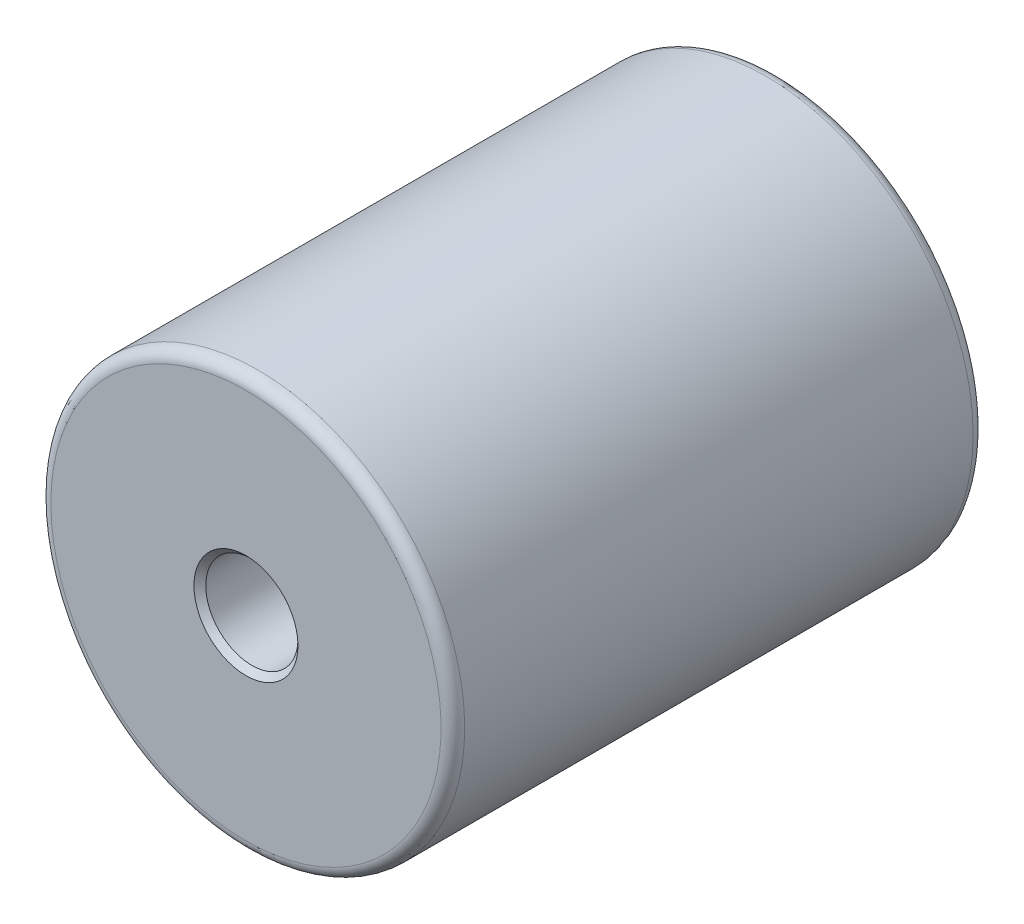
ISO-10303-21;
HEADER;
FILE_DESCRIPTION(('STEP AP214'),'2;1');
FILE_NAME('part.step','',(''),(''),'','','');
FILE_SCHEMA(('AUTOMOTIVE_DESIGN { 1 0 10303 214 1 1 1 1 }'));
ENDSEC;
DATA;
#1=APPLICATION_CONTEXT('core data for automotive mechanical design processes');
#2=APPLICATION_PROTOCOL_DEFINITION('international standard','automotive_design',2000,#1);
#3=PRODUCT_CONTEXT('',#1,'mechanical');
#4=PRODUCT('Part','Part','',(#3));
#5=PRODUCT_RELATED_PRODUCT_CATEGORY('part','',(#4));
#6=PRODUCT_DEFINITION_FORMATION('','',#4);
#7=PRODUCT_DEFINITION_CONTEXT('part definition',#1,'design');
#8=PRODUCT_DEFINITION('design','',#6,#7);
#9=PRODUCT_DEFINITION_SHAPE('','',#8);
#10=(LENGTH_UNIT() NAMED_UNIT(*) SI_UNIT(.MILLI.,.METRE.));
#11=(NAMED_UNIT(*) PLANE_ANGLE_UNIT() SI_UNIT($,.RADIAN.));
#12=(NAMED_UNIT(*) SI_UNIT($,.STERADIAN.) SOLID_ANGLE_UNIT());
#13=UNCERTAINTY_MEASURE_WITH_UNIT(LENGTH_MEASURE(1.E-05),#10,'distance_accuracy_value','');
#14=(GEOMETRIC_REPRESENTATION_CONTEXT(3) GLOBAL_UNCERTAINTY_ASSIGNED_CONTEXT((#13)) GLOBAL_UNIT_ASSIGNED_CONTEXT((#10,
#11,#12)) REPRESENTATION_CONTEXT('',''));
#15=CARTESIAN_POINT('',(0.,0.,0.));
#16=DIRECTION('',(0.,0.,1.));
#17=DIRECTION('',(1.,0.,0.));
#18=AXIS2_PLACEMENT_3D('',#15,#16,#17);
#19=CARTESIAN_POINT('',(0.,0.,-155.5));
#20=DIRECTION('',(0.,0.,1.));
#21=DIRECTION('',(1.,0.,0.));
#22=AXIS2_PLACEMENT_3D('',#19,#20,#21);
#23=CYLINDRICAL_SURFACE('',#22,7.8);
#24=CARTESIAN_POINT('',(0.,0.,-8.50000000000001));
#25=DIRECTION('',(0.,0.,-1.));
#26=DIRECTION('',(-1.,0.,0.));
#27=AXIS2_PLACEMENT_3D('',#24,#25,#26);
#28=CIRCLE('',#27,7.8);
#29=CARTESIAN_POINT('',(7.8,0.,-8.49999999999998));
#30=VERTEX_POINT('',#29);
#31=EDGE_CURVE('E10',#30,#30,#28,.F.);
#32=CARTESIAN_POINT('',(0.,0.,-96.4999999999999));
#33=DIRECTION('',(0.,0.,-1.));
#34=DIRECTION('',(-1.,0.,0.));
#35=AXIS2_PLACEMENT_3D('',#32,#33,#34);
#36=CIRCLE('',#35,7.8);
#37=CARTESIAN_POINT('',(7.8,0.,-96.4999999999999));
#38=VERTEX_POINT('',#37);
#39=EDGE_CURVE('E51',#38,#38,#36,.T.);
#40=CARTESIAN_POINT('',(7.8,0.,-8.49999999999998));
#41=CARTESIAN_POINT('',(7.8,0.,-9.41666666666665));
#42=CARTESIAN_POINT('',(7.8,0.,-10.3333333333333));
#43=CARTESIAN_POINT('',(7.8,0.,-12.1666666666666));
#44=CARTESIAN_POINT('',(7.8,0.,-13.0833333333333));
#45=CARTESIAN_POINT('',(7.8,0.,-14.9166666666667));
#46=CARTESIAN_POINT('',(7.8,0.,-15.8333333333333));
#47=CARTESIAN_POINT('',(7.8,0.,-17.6666666666667));
#48=CARTESIAN_POINT('',(7.8,0.,-18.5833333333333));
#49=CARTESIAN_POINT('',(7.8,0.,-20.4166666666667));
#50=CARTESIAN_POINT('',(7.8,0.,-21.3333333333333));
#51=CARTESIAN_POINT('',(7.8,0.,-23.1666666666666));
#52=CARTESIAN_POINT('',(7.8,0.,-24.0833333333333));
#53=CARTESIAN_POINT('',(7.8,0.,-25.9166666666666));
#54=CARTESIAN_POINT('',(7.8,0.,-26.8333333333333));
#55=CARTESIAN_POINT('',(7.8,0.,-28.6666666666666));
#56=CARTESIAN_POINT('',(7.8,0.,-29.5833333333333));
#57=CARTESIAN_POINT('',(7.8,0.,-31.4166666666666));
#58=CARTESIAN_POINT('',(7.8,0.,-32.3333333333333));
#59=CARTESIAN_POINT('',(7.8,0.,-34.1666666666666));
#60=CARTESIAN_POINT('',(7.8,0.,-35.0833333333333));
#61=CARTESIAN_POINT('',(7.8,0.,-36.9166666666666));
#62=CARTESIAN_POINT('',(7.8,0.,-37.8333333333333));
#63=CARTESIAN_POINT('',(7.8,0.,-39.6666666666666));
#64=CARTESIAN_POINT('',(7.8,0.,-40.5833333333333));
#65=CARTESIAN_POINT('',(7.8,0.,-42.4166666666666));
#66=CARTESIAN_POINT('',(7.8,0.,-43.3333333333333));
#67=CARTESIAN_POINT('',(7.8,0.,-45.1666666666666));
#68=CARTESIAN_POINT('',(7.8,0.,-46.0833333333333));
#69=CARTESIAN_POINT('',(7.8,0.,-47.9166666666666));
#70=CARTESIAN_POINT('',(7.8,0.,-48.8333333333333));
#71=CARTESIAN_POINT('',(7.8,0.,-50.6666666666666));
#72=CARTESIAN_POINT('',(7.8,0.,-51.5833333333333));
#73=CARTESIAN_POINT('',(7.8,0.,-53.4166666666666));
#74=CARTESIAN_POINT('',(7.8,0.,-54.3333333333333));
#75=CARTESIAN_POINT('',(7.8,0.,-56.1666666666666));
#76=CARTESIAN_POINT('',(7.8,0.,-57.0833333333333));
#77=CARTESIAN_POINT('',(7.8,0.,-58.9166666666666));
#78=CARTESIAN_POINT('',(7.8,0.,-59.8333333333333));
#79=CARTESIAN_POINT('',(7.8,0.,-61.6666666666666));
#80=CARTESIAN_POINT('',(7.8,0.,-62.5833333333333));
#81=CARTESIAN_POINT('',(7.8,0.,-64.4166666666666));
#82=CARTESIAN_POINT('',(7.8,0.,-65.3333333333333));
#83=CARTESIAN_POINT('',(7.8,0.,-67.1666666666666));
#84=CARTESIAN_POINT('',(7.8,0.,-68.0833333333333));
#85=CARTESIAN_POINT('',(7.8,0.,-69.9166666666666));
#86=CARTESIAN_POINT('',(7.8,0.,-70.8333333333333));
#87=CARTESIAN_POINT('',(7.8,0.,-72.6666666666666));
#88=CARTESIAN_POINT('',(7.8,0.,-73.5833333333333));
#89=CARTESIAN_POINT('',(7.8,0.,-75.4166666666666));
#90=CARTESIAN_POINT('',(7.8,0.,-76.3333333333333));
#91=CARTESIAN_POINT('',(7.8,0.,-78.1666666666666));
#92=CARTESIAN_POINT('',(7.8,0.,-79.0833333333333));
#93=CARTESIAN_POINT('',(7.8,0.,-80.9166666666666));
#94=CARTESIAN_POINT('',(7.8,0.,-81.8333333333333));
#95=CARTESIAN_POINT('',(7.8,0.,-83.6666666666666));
#96=CARTESIAN_POINT('',(7.8,0.,-84.5833333333333));
#97=CARTESIAN_POINT('',(7.8,0.,-86.4166666666666));
#98=CARTESIAN_POINT('',(7.8,0.,-87.3333333333333));
#99=CARTESIAN_POINT('',(7.8,0.,-89.1666666666666));
#100=CARTESIAN_POINT('',(7.8,0.,-90.0833333333333));
#101=CARTESIAN_POINT('',(7.8,0.,-91.9166666666666));
#102=CARTESIAN_POINT('',(7.8,0.,-92.8333333333333));
#103=CARTESIAN_POINT('',(7.8,0.,-94.6666666666666));
#104=CARTESIAN_POINT('',(7.8,0.,-95.5833333333333));
#105=CARTESIAN_POINT('',(7.8,0.,-96.4999999999999));
#106=B_SPLINE_CURVE_WITH_KNOTS('',3,(#40,#41,#42,#43,#44,#45,#46,#47,#48,#49,#50,#51,#52,#53,
#54,#55,#56,#57,#58,#59,#60,#61,#62,#63,#64,#65,#66,#67,#68,#69,#70,#71,#72,#73,#74,#75,#76,#77,
#78,#79,#80,#81,#82,#83,#84,#85,#86,#87,#88,#89,#90,#91,#92,#93,#94,#95,#96,#97,#98,#99,#100,
#101,#102,#103,#104,#105),.UNSPECIFIED.,.F.,.F.,(4,2,2,2,2,2,2,2,2,2,2,2,2,2,2,2,2,2,2,2,2,2,2,
2,2,2,2,2,2,2,2,2,4),(0.,2.75,5.50000000000001,8.25000000000001,11.,13.75,16.5,19.25,22.,24.75,
27.5,30.25,33.,35.75,38.5,41.25,44.,46.75,49.5,52.25,55.,57.75,60.5,63.25,66.,68.75,71.5,74.25,
77.,79.75,82.5,85.25,88.),.UNSPECIFIED.);
#107=EDGE_CURVE('BSEAM36',#30,#38,#106,.T.);
#108=ORIENTED_EDGE('',*,*,#31,.T.);
#109=ORIENTED_EDGE('',*,*,#39,.T.);
#110=ORIENTED_EDGE('',*,*,#107,.T.);
#111=ORIENTED_EDGE('',*,*,#107,.F.);
#112=EDGE_LOOP('',(#108,#110,#109,#111));
#113=FACE_BOUND('',#112,.T.);
#114=ADVANCED_FACE('F36',(#113),#23,.F.);
#115=CARTESIAN_POINT('',(0.,0.,-7.5));
#116=DIRECTION('',(0.,0.,-1.));
#117=DIRECTION('',(-1.,0.,0.));
#118=AXIS2_PLACEMENT_3D('',#115,#116,#117);
#119=PLANE('',#118);
#120=CARTESIAN_POINT('',(0.,0.,-7.5));
#121=DIRECTION('',(0.,0.,-1.));
#122=DIRECTION('',(-1.,0.,0.));
#123=AXIS2_PLACEMENT_3D('',#120,#121,#122);
#124=CIRCLE('',#123,8.80000000000001);
#125=CARTESIAN_POINT('',(-8.80000000000001,0.,-7.5));
#126=VERTEX_POINT('',#125);
#127=EDGE_CURVE('E43',#126,#126,#124,.T.);
#128=ORIENTED_EDGE('',*,*,#127,.T.);
#129=EDGE_LOOP('',(#128));
#130=FACE_BOUND('',#129,.T.);
#131=CARTESIAN_POINT('',(0.,0.,-7.5));
#132=DIRECTION('',(0.,0.,-1.));
#133=DIRECTION('',(-1.,0.,0.));
#134=AXIS2_PLACEMENT_3D('',#131,#132,#133);
#135=CIRCLE('',#134,33.);
#136=CARTESIAN_POINT('',(-33.,0.,-7.5));
#137=VERTEX_POINT('',#136);
#138=EDGE_CURVE('E56',#137,#137,#135,.F.);
#139=ORIENTED_EDGE('',*,*,#138,.T.);
#140=EDGE_LOOP('',(#139));
#141=FACE_BOUND('',#140,.T.);
#142=ADVANCED_FACE('F88',(#130,#141),#119,.F.);
#143=CARTESIAN_POINT('',(0.,0.,-97.5));
#144=DIRECTION('',(0.,0.,-1.));
#145=DIRECTION('',(-1.,0.,0.));
#146=AXIS2_PLACEMENT_3D('',#143,#144,#145);
#147=PLANE('',#146);
#148=CARTESIAN_POINT('',(0.,0.,-97.5));
#149=DIRECTION('',(0.,0.,-1.));
#150=DIRECTION('',(-1.,0.,0.));
#151=AXIS2_PLACEMENT_3D('',#148,#149,#150);
#152=CIRCLE('',#151,8.80000000000006);
#153=CARTESIAN_POINT('',(-8.80000000000006,0.,-97.5));
#154=VERTEX_POINT('',#153);
#155=EDGE_CURVE('E47',#154,#154,#152,.F.);
#156=ORIENTED_EDGE('',*,*,#155,.T.);
#157=EDGE_LOOP('',(#156));
#158=FACE_BOUND('',#157,.T.);
#159=CARTESIAN_POINT('',(0.,0.,-97.5));
#160=DIRECTION('',(0.,0.,-1.));
#161=DIRECTION('',(-1.,0.,0.));
#162=AXIS2_PLACEMENT_3D('',#159,#160,#161);
#163=CIRCLE('',#162,33.);
#164=CARTESIAN_POINT('',(-33.,0.,-97.5));
#165=VERTEX_POINT('',#164);
#166=EDGE_CURVE('E65',#165,#165,#163,.T.);
#167=ORIENTED_EDGE('',*,*,#166,.T.);
#168=EDGE_LOOP('',(#167));
#169=FACE_BOUND('',#168,.T.);
#170=ADVANCED_FACE('F69',(#158,#169),#147,.T.);
#171=CARTESIAN_POINT('',(0.,0.,-97.5));
#172=DIRECTION('',(0.,0.,1.));
#173=DIRECTION('',(1.,0.,0.));
#174=AXIS2_PLACEMENT_3D('',#171,#172,#173);
#175=CYLINDRICAL_SURFACE('',#174,35.);
#176=CARTESIAN_POINT('',(0.,0.,-95.5));
#177=DIRECTION('',(0.,0.,-1.));
#178=DIRECTION('',(-1.,0.,0.));
#179=AXIS2_PLACEMENT_3D('',#176,#177,#178);
#180=CIRCLE('',#179,35.);
#181=CARTESIAN_POINT('',(35.,0.,-95.5));
#182=VERTEX_POINT('',#181);
#183=EDGE_CURVE('E59',#182,#182,#180,.F.);
#184=CARTESIAN_POINT('',(0.,0.,-9.49999999999999));
#185=DIRECTION('',(0.,0.,-1.));
#186=DIRECTION('',(-1.,0.,0.));
#187=AXIS2_PLACEMENT_3D('',#184,#185,#186);
#188=CIRCLE('',#187,35.);
#189=CARTESIAN_POINT('',(35.,0.,-9.49999999999999));
#190=VERTEX_POINT('',#189);
#191=EDGE_CURVE('E62',#190,#190,#188,.T.);
#192=CARTESIAN_POINT('',(35.,0.,-95.5));
#193=CARTESIAN_POINT('',(35.,0.,-94.6041666666667));
#194=CARTESIAN_POINT('',(35.,0.,-93.7083333333333));
#195=CARTESIAN_POINT('',(35.,0.,-91.9166666666667));
#196=CARTESIAN_POINT('',(35.,0.,-91.0208333333333));
#197=CARTESIAN_POINT('',(35.,0.,-89.2291666666667));
#198=CARTESIAN_POINT('',(35.,0.,-88.3333333333333));
#199=CARTESIAN_POINT('',(35.,0.,-86.5416666666667));
#200=CARTESIAN_POINT('',(35.,0.,-85.6458333333333));
#201=CARTESIAN_POINT('',(35.,0.,-83.8541666666667));
#202=CARTESIAN_POINT('',(35.,0.,-82.9583333333333));
#203=CARTESIAN_POINT('',(35.,0.,-81.1666666666667));
#204=CARTESIAN_POINT('',(35.,0.,-80.2708333333333));
#205=CARTESIAN_POINT('',(35.,0.,-78.4791666666667));
#206=CARTESIAN_POINT('',(35.,0.,-77.5833333333333));
#207=CARTESIAN_POINT('',(35.,0.,-75.7916666666667));
#208=CARTESIAN_POINT('',(35.,0.,-74.8958333333333));
#209=CARTESIAN_POINT('',(35.,0.,-73.1041666666667));
#210=CARTESIAN_POINT('',(35.,0.,-72.2083333333333));
#211=CARTESIAN_POINT('',(35.,0.,-70.4166666666667));
#212=CARTESIAN_POINT('',(35.,0.,-69.5208333333333));
#213=CARTESIAN_POINT('',(35.,0.,-67.7291666666667));
#214=CARTESIAN_POINT('',(35.,0.,-66.8333333333333));
#215=CARTESIAN_POINT('',(35.,0.,-65.0416666666667));
#216=CARTESIAN_POINT('',(35.,0.,-64.1458333333333));
#217=CARTESIAN_POINT('',(35.,0.,-62.3541666666667));
#218=CARTESIAN_POINT('',(35.,0.,-61.4583333333333));
#219=CARTESIAN_POINT('',(35.,0.,-59.6666666666667));
#220=CARTESIAN_POINT('',(35.,0.,-58.7708333333333));
#221=CARTESIAN_POINT('',(35.,0.,-56.9791666666667));
#222=CARTESIAN_POINT('',(35.,0.,-56.0833333333333));
#223=CARTESIAN_POINT('',(35.,0.,-54.2916666666667));
#224=CARTESIAN_POINT('',(35.,0.,-53.3958333333333));
#225=CARTESIAN_POINT('',(35.,0.,-51.6041666666667));
#226=CARTESIAN_POINT('',(35.,0.,-50.7083333333333));
#227=CARTESIAN_POINT('',(35.,0.,-48.9166666666667));
#228=CARTESIAN_POINT('',(35.,0.,-48.0208333333333));
#229=CARTESIAN_POINT('',(35.,0.,-46.2291666666667));
#230=CARTESIAN_POINT('',(35.,0.,-45.3333333333333));
#231=CARTESIAN_POINT('',(35.,0.,-43.5416666666667));
#232=CARTESIAN_POINT('',(35.,0.,-42.6458333333333));
#233=CARTESIAN_POINT('',(35.,0.,-40.8541666666667));
#234=CARTESIAN_POINT('',(35.,0.,-39.9583333333333));
#235=CARTESIAN_POINT('',(35.,0.,-38.1666666666667));
#236=CARTESIAN_POINT('',(35.,0.,-37.2708333333333));
#237=CARTESIAN_POINT('',(35.,0.,-35.4791666666667));
#238=CARTESIAN_POINT('',(35.,0.,-34.5833333333333));
#239=CARTESIAN_POINT('',(35.,0.,-32.7916666666667));
#240=CARTESIAN_POINT('',(35.,0.,-31.8958333333333));
#241=CARTESIAN_POINT('',(35.,0.,-30.1041666666667));
#242=CARTESIAN_POINT('',(35.,0.,-29.2083333333333));
#243=CARTESIAN_POINT('',(35.,0.,-27.4166666666667));
#244=CARTESIAN_POINT('',(35.,0.,-26.5208333333333));
#245=CARTESIAN_POINT('',(35.,0.,-24.7291666666667));
#246=CARTESIAN_POINT('',(35.,0.,-23.8333333333333));
#247=CARTESIAN_POINT('',(35.,0.,-22.0416666666667));
#248=CARTESIAN_POINT('',(35.,0.,-21.1458333333333));
#249=CARTESIAN_POINT('',(35.,0.,-19.3541666666667));
#250=CARTESIAN_POINT('',(35.,0.,-18.4583333333333));
#251=CARTESIAN_POINT('',(35.,0.,-16.6666666666667));
#252=CARTESIAN_POINT('',(35.,0.,-15.7708333333333));
#253=CARTESIAN_POINT('',(35.,0.,-13.9791666666667));
#254=CARTESIAN_POINT('',(35.,0.,-13.0833333333333));
#255=CARTESIAN_POINT('',(35.,0.,-11.2916666666667));
#256=CARTESIAN_POINT('',(35.,0.,-10.3958333333333));
#257=CARTESIAN_POINT('',(35.,0.,-9.49999999999999));
#258=B_SPLINE_CURVE_WITH_KNOTS('',3,(#192,#193,#194,#195,#196,#197,#198,#199,#200,#201,#202,
#203,#204,#205,#206,#207,#208,#209,#210,#211,#212,#213,#214,#215,#216,#217,#218,#219,#220,#221,
#222,#223,#224,#225,#226,#227,#228,#229,#230,#231,#232,#233,#234,#235,#236,#237,#238,#239,#240,
#241,#242,#243,#244,#245,#246,#247,#248,#249,#250,#251,#252,#253,#254,#255,#256,#257),
.UNSPECIFIED.,.F.,.F.,(4,2,2,2,2,2,2,2,2,2,2,2,2,2,2,2,2,2,2,2,2,2,2,2,2,2,2,2,2,2,2,2,4),(0.,
2.6875,5.37499999999999,8.06249999999999,10.75,13.4375,16.125,18.8125,21.5,24.1875,26.875,
29.5625,32.25,34.9375,37.625,40.3125,43.,45.6875,48.375,51.0625,53.75,56.4375,59.125,61.8125,
64.5,67.1875,69.875,72.5625,75.25,77.9375,80.625,83.3125,86.),.UNSPECIFIED.);
#259=EDGE_CURVE('BSEAM74',#182,#190,#258,.T.);
#260=ORIENTED_EDGE('',*,*,#183,.T.);
#261=ORIENTED_EDGE('',*,*,#191,.T.);
#262=ORIENTED_EDGE('',*,*,#259,.T.);
#263=ORIENTED_EDGE('',*,*,#259,.F.);
#264=EDGE_LOOP('',(#260,#262,#261,#263));
#265=FACE_BOUND('',#264,.T.);
#266=ADVANCED_FACE('F74',(#265),#175,.T.);
#267=CARTESIAN_POINT('',(0.,0.,-95.5));
#268=DIRECTION('',(0.,0.,-1.));
#269=DIRECTION('',(-1.,0.,0.));
#270=AXIS2_PLACEMENT_3D('',#267,#268,#269);
#271=TOROIDAL_SURFACE('',#270,33.,2.);
#272=ORIENTED_EDGE('',*,*,#183,.F.);
#273=EDGE_LOOP('',(#272));
#274=FACE_BOUND('',#273,.T.);
#275=ORIENTED_EDGE('',*,*,#166,.F.);
#276=EDGE_LOOP('',(#275));
#277=FACE_BOUND('',#276,.T.);
#278=ADVANCED_FACE('F71',(#274,#277),#271,.T.);
#279=CARTESIAN_POINT('',(0.,0.,-9.49999999999999));
#280=DIRECTION('',(0.,0.,-1.));
#281=DIRECTION('',(-1.,0.,0.));
#282=AXIS2_PLACEMENT_3D('',#279,#280,#281);
#283=TOROIDAL_SURFACE('',#282,33.,2.);
#284=ORIENTED_EDGE('',*,*,#138,.F.);
#285=EDGE_LOOP('',(#284));
#286=FACE_BOUND('',#285,.T.);
#287=ORIENTED_EDGE('',*,*,#191,.F.);
#288=EDGE_LOOP('',(#287));
#289=FACE_BOUND('',#288,.T.);
#290=ADVANCED_FACE('F73',(#286,#289),#283,.T.);
#291=CARTESIAN_POINT('',(0.,0.,-96.4999999999999));
#292=DIRECTION('',(0.,0.,-1.));
#293=DIRECTION('',(-1.,0.,0.));
#294=AXIS2_PLACEMENT_3D('',#291,#292,#293);
#295=CONICAL_SURFACE('',#294,7.8,0.785398163397448);
#296=ORIENTED_EDGE('',*,*,#155,.F.);
#297=EDGE_LOOP('',(#296));
#298=FACE_BOUND('',#297,.T.);
#299=ORIENTED_EDGE('',*,*,#39,.F.);
#300=EDGE_LOOP('',(#299));
#301=FACE_BOUND('',#300,.T.);
#302=ADVANCED_FACE('F81',(#298,#301),#295,.F.);
#303=CARTESIAN_POINT('',(0.,0.,-7.50000000000001));
#304=DIRECTION('',(0.,0.,1.));
#305=DIRECTION('',(1.,0.,0.));
#306=AXIS2_PLACEMENT_3D('',#303,#304,#305);
#307=CONICAL_SURFACE('',#306,8.8,0.785398163397448);
#308=ORIENTED_EDGE('',*,*,#31,.F.);
#309=EDGE_LOOP('',(#308));
#310=FACE_BOUND('',#309,.T.);
#311=ORIENTED_EDGE('',*,*,#127,.F.);
#312=EDGE_LOOP('',(#311));
#313=FACE_BOUND('',#312,.T.);
#314=ADVANCED_FACE('F38',(#310,#313),#307,.F.);
#315=CLOSED_SHELL('',(#114,#142,#170,#266,#278,#290,#302,#314));
#316=MANIFOLD_SOLID_BREP('B2',#315);
#317=ADVANCED_BREP_SHAPE_REPRESENTATION('',(#18,#316),#14);
#318=SHAPE_DEFINITION_REPRESENTATION(#9,#317);
ENDSEC;
END-ISO-10303-21;
